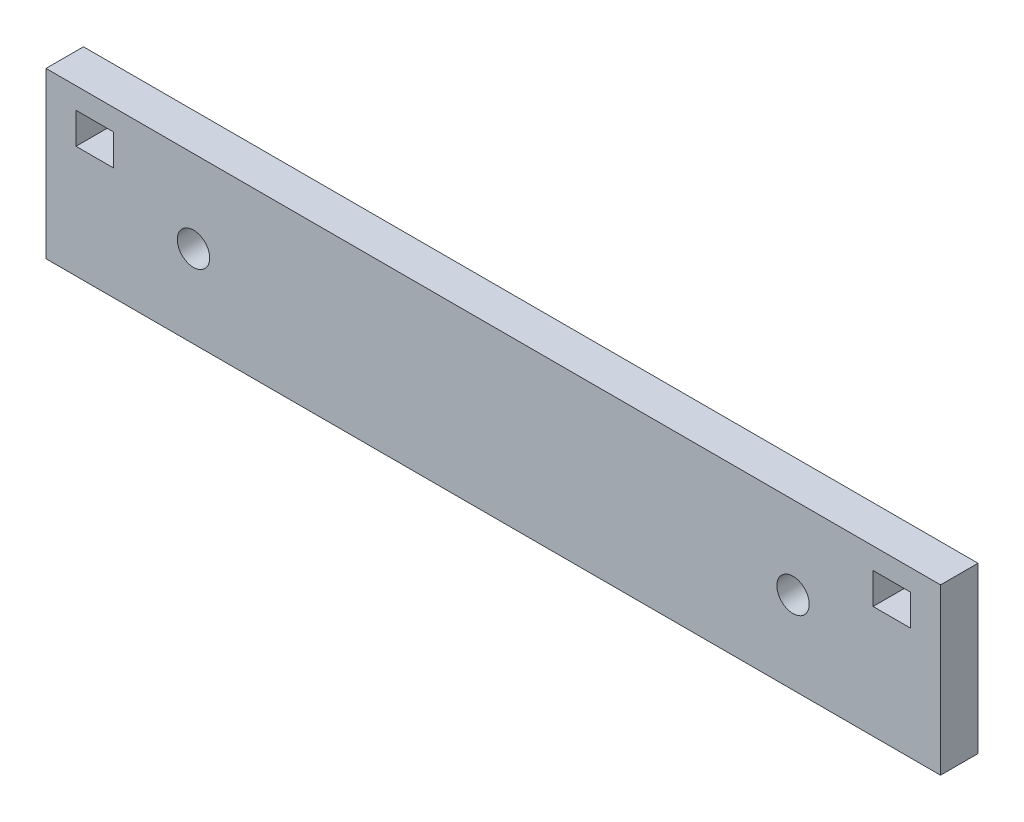
ISO-10303-21;
HEADER;
FILE_DESCRIPTION(('STEP AP214'),'2;1');
FILE_NAME('part.step','',(''),(''),'','','');
FILE_SCHEMA(('AUTOMOTIVE_DESIGN { 1 0 10303 214 1 1 1 1 }'));
ENDSEC;
DATA;
#1=APPLICATION_CONTEXT('core data for automotive mechanical design processes');
#2=APPLICATION_PROTOCOL_DEFINITION('international standard','automotive_design',2000,#1);
#3=PRODUCT_CONTEXT('',#1,'mechanical');
#4=PRODUCT('Part','Part','',(#3));
#5=PRODUCT_RELATED_PRODUCT_CATEGORY('part','',(#4));
#6=PRODUCT_DEFINITION_FORMATION('','',#4);
#7=PRODUCT_DEFINITION_CONTEXT('part definition',#1,'design');
#8=PRODUCT_DEFINITION('design','',#6,#7);
#9=PRODUCT_DEFINITION_SHAPE('','',#8);
#10=(LENGTH_UNIT() NAMED_UNIT(*) SI_UNIT(.MILLI.,.METRE.));
#11=(NAMED_UNIT(*) PLANE_ANGLE_UNIT() SI_UNIT($,.RADIAN.));
#12=(NAMED_UNIT(*) SI_UNIT($,.STERADIAN.) SOLID_ANGLE_UNIT());
#13=UNCERTAINTY_MEASURE_WITH_UNIT(LENGTH_MEASURE(1.E-05),#10,'distance_accuracy_value','');
#14=(GEOMETRIC_REPRESENTATION_CONTEXT(3) GLOBAL_UNCERTAINTY_ASSIGNED_CONTEXT((#13)) GLOBAL_UNIT_ASSIGNED_CONTEXT((#10,
#11,#12)) REPRESENTATION_CONTEXT('',''));
#15=CARTESIAN_POINT('',(0.,0.,0.));
#16=DIRECTION('',(0.,0.,1.));
#17=DIRECTION('',(1.,0.,0.));
#18=AXIS2_PLACEMENT_3D('',#15,#16,#17);
#19=CARTESIAN_POINT('',(-18.9484,3.4925,1.5875));
#20=DIRECTION('',(0.,0.,1.));
#21=DIRECTION('',(1.,0.,0.));
#22=AXIS2_PLACEMENT_3D('',#19,#20,#21);
#23=PLANE('',#22);
#24=CARTESIAN_POINT('',(-12.7,0.,1.5875));
#25=DIRECTION('',(0.,0.,1.));
#26=DIRECTION('',(1.,0.,0.));
#27=AXIS2_PLACEMENT_3D('',#24,#25,#26);
#28=CIRCLE('',#27,0.685800000000001);
#29=CARTESIAN_POINT('',(-12.0142,0.,1.5875));
#30=VERTEX_POINT('',#29);
#31=EDGE_CURVE('E151',#30,#30,#28,.T.);
#32=ORIENTED_EDGE('',*,*,#31,.F.);
#33=EDGE_LOOP('',(#32));
#34=FACE_BOUND('',#33,.T.);
#35=DIRECTION('',(0.,-1.,0.));
#36=VECTOR('',#35,1.);
#37=CARTESIAN_POINT('',(-17.6784,2.5908,1.5875));
#38=LINE('',#37,#36);
#39=CARTESIAN_POINT('',(-17.6784,2.5908,1.5875));
#40=VERTEX_POINT('',#39);
#41=CARTESIAN_POINT('',(-17.6784,1.27,1.5875));
#42=VERTEX_POINT('',#41);
#43=EDGE_CURVE('E163',#40,#42,#38,.T.);
#44=ORIENTED_EDGE('',*,*,#43,.F.);
#45=DIRECTION('',(-1.,0.,0.));
#46=VECTOR('',#45,1.);
#47=CARTESIAN_POINT('',(-16.0909,2.5908,1.5875));
#48=LINE('',#47,#46);
#49=CARTESIAN_POINT('',(-16.0909,2.5908,1.5875));
#50=VERTEX_POINT('',#49);
#51=EDGE_CURVE('E161',#50,#40,#48,.T.);
#52=ORIENTED_EDGE('',*,*,#51,.F.);
#53=DIRECTION('',(0.,1.,0.));
#54=VECTOR('',#53,1.);
#55=CARTESIAN_POINT('',(-16.0909,1.27,1.5875));
#56=LINE('',#55,#54);
#57=CARTESIAN_POINT('',(-16.0909,1.27,1.5875));
#58=VERTEX_POINT('',#57);
#59=EDGE_CURVE('E169',#58,#50,#56,.T.);
#60=ORIENTED_EDGE('',*,*,#59,.F.);
#61=DIRECTION('',(1.,0.,0.));
#62=VECTOR('',#61,1.);
#63=CARTESIAN_POINT('',(-17.6784,1.27,1.5875));
#64=LINE('',#63,#62);
#65=EDGE_CURVE('E166',#42,#58,#64,.T.);
#66=ORIENTED_EDGE('',*,*,#65,.F.);
#67=EDGE_LOOP('',(#44,#52,#60,#66));
#68=FACE_BOUND('',#67,.T.);
#69=DIRECTION('',(0.,-1.,0.));
#70=VECTOR('',#69,1.);
#71=CARTESIAN_POINT('',(-18.9484,-3.4925,1.5875));
#72=LINE('',#71,#70);
#73=CARTESIAN_POINT('',(-18.9484,3.4925,1.5875));
#74=VERTEX_POINT('',#73);
#75=CARTESIAN_POINT('',(-18.9484,-3.4925,1.5875));
#76=VERTEX_POINT('',#75);
#77=EDGE_CURVE('E192',#74,#76,#72,.T.);
#78=ORIENTED_EDGE('',*,*,#77,.T.);
#79=DIRECTION('',(1.,0.,0.));
#80=VECTOR('',#79,1.);
#81=CARTESIAN_POINT('',(18.9484,-3.4925,1.5875));
#82=LINE('',#81,#80);
#83=CARTESIAN_POINT('',(18.9484,-3.4925,1.5875));
#84=VERTEX_POINT('',#83);
#85=EDGE_CURVE('E195',#76,#84,#82,.T.);
#86=ORIENTED_EDGE('',*,*,#85,.T.);
#87=DIRECTION('',(0.,1.,0.));
#88=VECTOR('',#87,1.);
#89=CARTESIAN_POINT('',(18.9484,-3.4925,1.5875));
#90=LINE('',#89,#88);
#91=CARTESIAN_POINT('',(18.9484,3.4925,1.5875));
#92=VERTEX_POINT('',#91);
#93=EDGE_CURVE('E198',#84,#92,#90,.T.);
#94=ORIENTED_EDGE('',*,*,#93,.T.);
#95=DIRECTION('',(-1.,0.,0.));
#96=VECTOR('',#95,1.);
#97=CARTESIAN_POINT('',(18.9484,3.4925,1.5875));
#98=LINE('',#97,#96);
#99=EDGE_CURVE('E200',#92,#74,#98,.T.);
#100=ORIENTED_EDGE('',*,*,#99,.T.);
#101=EDGE_LOOP('',(#78,#86,#94,#100));
#102=FACE_BOUND('',#101,.T.);
#103=DIRECTION('',(0.,-1.,0.));
#104=VECTOR('',#103,1.);
#105=CARTESIAN_POINT('',(16.0909,2.59080000000001,1.5875));
#106=LINE('',#105,#104);
#107=CARTESIAN_POINT('',(16.0909,2.59080000000001,1.5875));
#108=VERTEX_POINT('',#107);
#109=CARTESIAN_POINT('',(16.0909,1.27000000000001,1.5875));
#110=VERTEX_POINT('',#109);
#111=EDGE_CURVE('E130',#108,#110,#106,.T.);
#112=ORIENTED_EDGE('',*,*,#111,.F.);
#113=DIRECTION('',(-1.,0.,0.));
#114=VECTOR('',#113,1.);
#115=CARTESIAN_POINT('',(17.6784,2.59080000000001,1.5875));
#116=LINE('',#115,#114);
#117=CARTESIAN_POINT('',(17.6784,2.59080000000001,1.5875));
#118=VERTEX_POINT('',#117);
#119=EDGE_CURVE('E122',#118,#108,#116,.T.);
#120=ORIENTED_EDGE('',*,*,#119,.F.);
#121=DIRECTION('',(0.,1.,0.));
#122=VECTOR('',#121,1.);
#123=CARTESIAN_POINT('',(17.6784,1.27,1.5875));
#124=LINE('',#123,#122);
#125=CARTESIAN_POINT('',(17.6784,1.27000000000001,1.5875));
#126=VERTEX_POINT('',#125);
#127=EDGE_CURVE('E145',#126,#118,#124,.T.);
#128=ORIENTED_EDGE('',*,*,#127,.F.);
#129=DIRECTION('',(1.,0.,0.));
#130=VECTOR('',#129,1.);
#131=CARTESIAN_POINT('',(16.0909,1.27000000000001,1.5875));
#132=LINE('',#131,#130);
#133=EDGE_CURVE('E143',#110,#126,#132,.T.);
#134=ORIENTED_EDGE('',*,*,#133,.F.);
#135=EDGE_LOOP('',(#112,#120,#128,#134));
#136=FACE_BOUND('',#135,.T.);
#137=CARTESIAN_POINT('',(12.7,0.,1.5875));
#138=DIRECTION('',(0.,0.,1.));
#139=DIRECTION('',(-1.,0.,0.));
#140=AXIS2_PLACEMENT_3D('',#137,#138,#139);
#141=CIRCLE('',#140,0.685800000000001);
#142=CARTESIAN_POINT('',(12.0142,0.,1.5875));
#143=VERTEX_POINT('',#142);
#144=EDGE_CURVE('E310',#143,#143,#141,.T.);
#145=ORIENTED_EDGE('',*,*,#144,.F.);
#146=EDGE_LOOP('',(#145));
#147=FACE_BOUND('',#146,.T.);
#148=ADVANCED_FACE('F33',(#34,#68,#102,#136,#147),#23,.T.);
#149=CARTESIAN_POINT('',(-18.9484,3.4925,0.));
#150=DIRECTION('',(0.,0.,1.));
#151=DIRECTION('',(1.,0.,0.));
#152=AXIS2_PLACEMENT_3D('',#149,#150,#151);
#153=PLANE('',#152);
#154=CARTESIAN_POINT('',(-12.7,0.,0.));
#155=DIRECTION('',(0.,0.,1.));
#156=DIRECTION('',(1.,0.,0.));
#157=AXIS2_PLACEMENT_3D('',#154,#155,#156);
#158=CIRCLE('',#157,0.685800000000001);
#159=CARTESIAN_POINT('',(-12.0142,0.,0.));
#160=VERTEX_POINT('',#159);
#161=EDGE_CURVE('E316',#160,#160,#158,.T.);
#162=ORIENTED_EDGE('',*,*,#161,.T.);
#163=EDGE_LOOP('',(#162));
#164=FACE_BOUND('',#163,.T.);
#165=DIRECTION('',(-1.,0.,0.));
#166=VECTOR('',#165,1.);
#167=CARTESIAN_POINT('',(-16.0909,2.5908,0.));
#168=LINE('',#167,#166);
#169=CARTESIAN_POINT('',(-16.0909,2.5908,0.));
#170=VERTEX_POINT('',#169);
#171=CARTESIAN_POINT('',(-17.6784,2.5908,0.));
#172=VERTEX_POINT('',#171);
#173=EDGE_CURVE('E138',#170,#172,#168,.T.);
#174=ORIENTED_EDGE('',*,*,#173,.T.);
#175=DIRECTION('',(0.,-1.,0.));
#176=VECTOR('',#175,1.);
#177=CARTESIAN_POINT('',(-17.6784,2.5908,0.));
#178=LINE('',#177,#176);
#179=CARTESIAN_POINT('',(-17.6784,1.27,0.));
#180=VERTEX_POINT('',#179);
#181=EDGE_CURVE('E174',#172,#180,#178,.T.);
#182=ORIENTED_EDGE('',*,*,#181,.T.);
#183=DIRECTION('',(1.,0.,0.));
#184=VECTOR('',#183,1.);
#185=CARTESIAN_POINT('',(-17.6784,1.27,0.));
#186=LINE('',#185,#184);
#187=CARTESIAN_POINT('',(-16.0909,1.27,0.));
#188=VERTEX_POINT('',#187);
#189=EDGE_CURVE('E177',#180,#188,#186,.T.);
#190=ORIENTED_EDGE('',*,*,#189,.T.);
#191=DIRECTION('',(0.,1.,0.));
#192=VECTOR('',#191,1.);
#193=CARTESIAN_POINT('',(-16.0909,1.27,0.));
#194=LINE('',#193,#192);
#195=EDGE_CURVE('E164',#188,#170,#194,.T.);
#196=ORIENTED_EDGE('',*,*,#195,.T.);
#197=EDGE_LOOP('',(#174,#182,#190,#196));
#198=FACE_BOUND('',#197,.T.);
#199=DIRECTION('',(0.,-1.,0.));
#200=VECTOR('',#199,1.);
#201=CARTESIAN_POINT('',(-18.9484,-3.4925,0.));
#202=LINE('',#201,#200);
#203=CARTESIAN_POINT('',(-18.9484,3.4925,0.));
#204=VERTEX_POINT('',#203);
#205=CARTESIAN_POINT('',(-18.9484,-3.4925,0.));
#206=VERTEX_POINT('',#205);
#207=EDGE_CURVE('E191',#204,#206,#202,.T.);
#208=ORIENTED_EDGE('',*,*,#207,.F.);
#209=DIRECTION('',(-1.,0.,0.));
#210=VECTOR('',#209,1.);
#211=CARTESIAN_POINT('',(18.9484,3.4925,0.));
#212=LINE('',#211,#210);
#213=CARTESIAN_POINT('',(18.9484,3.4925,0.));
#214=VERTEX_POINT('',#213);
#215=EDGE_CURVE('E196',#214,#204,#212,.T.);
#216=ORIENTED_EDGE('',*,*,#215,.F.);
#217=DIRECTION('',(0.,1.,0.));
#218=VECTOR('',#217,1.);
#219=CARTESIAN_POINT('',(18.9484,-3.4925,0.));
#220=LINE('',#219,#218);
#221=CARTESIAN_POINT('',(18.9484,-3.4925,0.));
#222=VERTEX_POINT('',#221);
#223=EDGE_CURVE('E207',#222,#214,#220,.T.);
#224=ORIENTED_EDGE('',*,*,#223,.F.);
#225=DIRECTION('',(1.,0.,0.));
#226=VECTOR('',#225,1.);
#227=CARTESIAN_POINT('',(18.9484,-3.4925,0.));
#228=LINE('',#227,#226);
#229=EDGE_CURVE('E205',#206,#222,#228,.T.);
#230=ORIENTED_EDGE('',*,*,#229,.F.);
#231=EDGE_LOOP('',(#208,#216,#224,#230));
#232=FACE_BOUND('',#231,.T.);
#233=DIRECTION('',(-1.,0.,0.));
#234=VECTOR('',#233,1.);
#235=CARTESIAN_POINT('',(17.6784,2.59080000000001,0.));
#236=LINE('',#235,#234);
#237=CARTESIAN_POINT('',(17.6784,2.59080000000001,0.));
#238=VERTEX_POINT('',#237);
#239=CARTESIAN_POINT('',(16.0909,2.59080000000001,0.));
#240=VERTEX_POINT('',#239);
#241=EDGE_CURVE('E56',#238,#240,#236,.T.);
#242=ORIENTED_EDGE('',*,*,#241,.T.);
#243=DIRECTION('',(0.,-1.,0.));
#244=VECTOR('',#243,1.);
#245=CARTESIAN_POINT('',(16.0909,2.59080000000001,0.));
#246=LINE('',#245,#244);
#247=CARTESIAN_POINT('',(16.0909,1.27000000000001,0.));
#248=VERTEX_POINT('',#247);
#249=EDGE_CURVE('E137',#240,#248,#246,.T.);
#250=ORIENTED_EDGE('',*,*,#249,.T.);
#251=DIRECTION('',(1.,0.,0.));
#252=VECTOR('',#251,1.);
#253=CARTESIAN_POINT('',(16.0909,1.27000000000001,0.));
#254=LINE('',#253,#252);
#255=CARTESIAN_POINT('',(17.6784,1.27,0.));
#256=VERTEX_POINT('',#255);
#257=EDGE_CURVE('E153',#248,#256,#254,.T.);
#258=ORIENTED_EDGE('',*,*,#257,.T.);
#259=DIRECTION('',(0.,1.,0.));
#260=VECTOR('',#259,1.);
#261=CARTESIAN_POINT('',(17.6784,1.27,0.));
#262=LINE('',#261,#260);
#263=EDGE_CURVE('E131',#256,#238,#262,.T.);
#264=ORIENTED_EDGE('',*,*,#263,.T.);
#265=EDGE_LOOP('',(#242,#250,#258,#264));
#266=FACE_BOUND('',#265,.T.);
#267=CARTESIAN_POINT('',(12.7,0.,0.));
#268=DIRECTION('',(0.,0.,1.));
#269=DIRECTION('',(-1.,0.,0.));
#270=AXIS2_PLACEMENT_3D('',#267,#268,#269);
#271=CIRCLE('',#270,0.685800000000001);
#272=CARTESIAN_POINT('',(12.0142,0.,0.));
#273=VERTEX_POINT('',#272);
#274=EDGE_CURVE('E313',#273,#273,#271,.T.);
#275=ORIENTED_EDGE('',*,*,#274,.T.);
#276=EDGE_LOOP('',(#275));
#277=FACE_BOUND('',#276,.T.);
#278=ADVANCED_FACE('F225',(#164,#198,#232,#266,#277),#153,.F.);
#279=CARTESIAN_POINT('',(-18.9484,-3.4925,1.5875));
#280=DIRECTION('',(1.,0.,0.));
#281=DIRECTION('',(0.,0.,-1.));
#282=AXIS2_PLACEMENT_3D('',#279,#280,#281);
#283=PLANE('',#282);
#284=ORIENTED_EDGE('',*,*,#207,.T.);
#285=DIRECTION('',(0.,0.,-1.));
#286=VECTOR('',#285,1.);
#287=CARTESIAN_POINT('',(-18.9484,-3.4925,1.5875));
#288=LINE('',#287,#286);
#289=EDGE_CURVE('E11',#76,#206,#288,.T.);
#290=ORIENTED_EDGE('',*,*,#289,.F.);
#291=ORIENTED_EDGE('',*,*,#77,.F.);
#292=DIRECTION('',(0.,0.,-1.));
#293=VECTOR('',#292,1.);
#294=CARTESIAN_POINT('',(-18.9484,3.4925,1.5875));
#295=LINE('',#294,#293);
#296=EDGE_CURVE('E202',#74,#204,#295,.T.);
#297=ORIENTED_EDGE('',*,*,#296,.T.);
#298=EDGE_LOOP('',(#284,#290,#291,#297));
#299=FACE_BOUND('',#298,.T.);
#300=ADVANCED_FACE('F35',(#299),#283,.F.);
#301=CARTESIAN_POINT('',(18.9484,-3.4925,1.5875));
#302=DIRECTION('',(0.,1.,0.));
#303=DIRECTION('',(0.,0.,1.));
#304=AXIS2_PLACEMENT_3D('',#301,#302,#303);
#305=PLANE('',#304);
#306=ORIENTED_EDGE('',*,*,#229,.T.);
#307=DIRECTION('',(0.,0.,-1.));
#308=VECTOR('',#307,1.);
#309=CARTESIAN_POINT('',(18.9484,-3.4925,1.5875));
#310=LINE('',#309,#308);
#311=EDGE_CURVE('E41',#84,#222,#310,.T.);
#312=ORIENTED_EDGE('',*,*,#311,.F.);
#313=ORIENTED_EDGE('',*,*,#85,.F.);
#314=ORIENTED_EDGE('',*,*,#289,.T.);
#315=EDGE_LOOP('',(#306,#312,#313,#314));
#316=FACE_BOUND('',#315,.T.);
#317=ADVANCED_FACE('F235',(#316),#305,.F.);
#318=CARTESIAN_POINT('',(18.9484,-3.4925,1.5875));
#319=DIRECTION('',(-1.,0.,0.));
#320=DIRECTION('',(0.,0.,1.));
#321=AXIS2_PLACEMENT_3D('',#318,#319,#320);
#322=PLANE('',#321);
#323=ORIENTED_EDGE('',*,*,#223,.T.);
#324=DIRECTION('',(0.,0.,-1.));
#325=VECTOR('',#324,1.);
#326=CARTESIAN_POINT('',(18.9484,3.4925,1.5875));
#327=LINE('',#326,#325);
#328=EDGE_CURVE('E212',#92,#214,#327,.T.);
#329=ORIENTED_EDGE('',*,*,#328,.F.);
#330=ORIENTED_EDGE('',*,*,#93,.F.);
#331=ORIENTED_EDGE('',*,*,#311,.T.);
#332=EDGE_LOOP('',(#323,#329,#330,#331));
#333=FACE_BOUND('',#332,.T.);
#334=ADVANCED_FACE('F219',(#333),#322,.F.);
#335=CARTESIAN_POINT('',(18.9484,3.4925,1.5875));
#336=DIRECTION('',(0.,-1.,0.));
#337=DIRECTION('',(0.,0.,-1.));
#338=AXIS2_PLACEMENT_3D('',#335,#336,#337);
#339=PLANE('',#338);
#340=ORIENTED_EDGE('',*,*,#215,.T.);
#341=ORIENTED_EDGE('',*,*,#296,.F.);
#342=ORIENTED_EDGE('',*,*,#99,.F.);
#343=ORIENTED_EDGE('',*,*,#328,.T.);
#344=EDGE_LOOP('',(#340,#341,#342,#343));
#345=FACE_BOUND('',#344,.T.);
#346=ADVANCED_FACE('F229',(#345),#339,.F.);
#347=CARTESIAN_POINT('',(-16.0909,2.5908,1.5875));
#348=DIRECTION('',(0.,-1.,0.));
#349=DIRECTION('',(0.,0.,-1.));
#350=AXIS2_PLACEMENT_3D('',#347,#348,#349);
#351=PLANE('',#350);
#352=ORIENTED_EDGE('',*,*,#173,.F.);
#353=DIRECTION('',(0.,0.,-1.));
#354=VECTOR('',#353,1.);
#355=CARTESIAN_POINT('',(-16.0909,2.5908,1.5875));
#356=LINE('',#355,#354);
#357=EDGE_CURVE('E171',#50,#170,#356,.T.);
#358=ORIENTED_EDGE('',*,*,#357,.F.);
#359=ORIENTED_EDGE('',*,*,#51,.T.);
#360=DIRECTION('',(0.,0.,-1.));
#361=VECTOR('',#360,1.);
#362=CARTESIAN_POINT('',(-17.6784,2.5908,1.5875));
#363=LINE('',#362,#361);
#364=EDGE_CURVE('E188',#40,#172,#363,.T.);
#365=ORIENTED_EDGE('',*,*,#364,.T.);
#366=EDGE_LOOP('',(#352,#358,#359,#365));
#367=FACE_BOUND('',#366,.T.);
#368=ADVANCED_FACE('F253',(#367),#351,.T.);
#369=CARTESIAN_POINT('',(-17.6784,2.5908,1.5875));
#370=DIRECTION('',(1.,0.,0.));
#371=DIRECTION('',(0.,0.,-1.));
#372=AXIS2_PLACEMENT_3D('',#369,#370,#371);
#373=PLANE('',#372);
#374=ORIENTED_EDGE('',*,*,#181,.F.);
#375=ORIENTED_EDGE('',*,*,#364,.F.);
#376=ORIENTED_EDGE('',*,*,#43,.T.);
#377=DIRECTION('',(0.,0.,-1.));
#378=VECTOR('',#377,1.);
#379=CARTESIAN_POINT('',(-17.6784,1.27,1.5875));
#380=LINE('',#379,#378);
#381=EDGE_CURVE('E186',#42,#180,#380,.T.);
#382=ORIENTED_EDGE('',*,*,#381,.T.);
#383=EDGE_LOOP('',(#374,#375,#376,#382));
#384=FACE_BOUND('',#383,.T.);
#385=ADVANCED_FACE('F260',(#384),#373,.T.);
#386=CARTESIAN_POINT('',(-17.6784,1.27,1.5875));
#387=DIRECTION('',(0.,1.,0.));
#388=DIRECTION('',(-1.,0.,0.));
#389=AXIS2_PLACEMENT_3D('',#386,#387,#388);
#390=PLANE('',#389);
#391=ORIENTED_EDGE('',*,*,#189,.F.);
#392=ORIENTED_EDGE('',*,*,#381,.F.);
#393=ORIENTED_EDGE('',*,*,#65,.T.);
#394=DIRECTION('',(0.,0.,-1.));
#395=VECTOR('',#394,1.);
#396=CARTESIAN_POINT('',(-16.0909,1.27,1.5875));
#397=LINE('',#396,#395);
#398=EDGE_CURVE('E184',#58,#188,#397,.T.);
#399=ORIENTED_EDGE('',*,*,#398,.T.);
#400=EDGE_LOOP('',(#391,#392,#393,#399));
#401=FACE_BOUND('',#400,.T.);
#402=ADVANCED_FACE('F265',(#401),#390,.T.);
#403=CARTESIAN_POINT('',(-16.0909,1.27,1.5875));
#404=DIRECTION('',(-1.,0.,0.));
#405=DIRECTION('',(0.,0.,1.));
#406=AXIS2_PLACEMENT_3D('',#403,#404,#405);
#407=PLANE('',#406);
#408=ORIENTED_EDGE('',*,*,#195,.F.);
#409=ORIENTED_EDGE('',*,*,#398,.F.);
#410=ORIENTED_EDGE('',*,*,#59,.T.);
#411=ORIENTED_EDGE('',*,*,#357,.T.);
#412=EDGE_LOOP('',(#408,#409,#410,#411));
#413=FACE_BOUND('',#412,.T.);
#414=ADVANCED_FACE('F273',(#413),#407,.T.);
#415=CARTESIAN_POINT('',(17.6784,2.59080000000001,1.5875));
#416=DIRECTION('',(0.,-1.,0.));
#417=DIRECTION('',(0.,0.,-1.));
#418=AXIS2_PLACEMENT_3D('',#415,#416,#417);
#419=PLANE('',#418);
#420=ORIENTED_EDGE('',*,*,#241,.F.);
#421=DIRECTION('',(0.,0.,-1.));
#422=VECTOR('',#421,1.);
#423=CARTESIAN_POINT('',(17.6784,2.59080000000001,1.5875));
#424=LINE('',#423,#422);
#425=EDGE_CURVE('E126',#118,#238,#424,.T.);
#426=ORIENTED_EDGE('',*,*,#425,.F.);
#427=ORIENTED_EDGE('',*,*,#119,.T.);
#428=DIRECTION('',(0.,0.,-1.));
#429=VECTOR('',#428,1.);
#430=CARTESIAN_POINT('',(16.0909,2.59080000000001,1.5875));
#431=LINE('',#430,#429);
#432=EDGE_CURVE('E125',#108,#240,#431,.T.);
#433=ORIENTED_EDGE('',*,*,#432,.T.);
#434=EDGE_LOOP('',(#420,#426,#427,#433));
#435=FACE_BOUND('',#434,.T.);
#436=ADVANCED_FACE('F124',(#435),#419,.T.);
#437=CARTESIAN_POINT('',(16.0909,2.59080000000001,1.5875));
#438=DIRECTION('',(1.,0.,0.));
#439=DIRECTION('',(0.,0.,-1.));
#440=AXIS2_PLACEMENT_3D('',#437,#438,#439);
#441=PLANE('',#440);
#442=ORIENTED_EDGE('',*,*,#249,.F.);
#443=ORIENTED_EDGE('',*,*,#432,.F.);
#444=ORIENTED_EDGE('',*,*,#111,.T.);
#445=DIRECTION('',(0.,0.,-1.));
#446=VECTOR('',#445,1.);
#447=CARTESIAN_POINT('',(16.0909,1.27000000000001,1.5875));
#448=LINE('',#447,#446);
#449=EDGE_CURVE('E139',#110,#248,#448,.T.);
#450=ORIENTED_EDGE('',*,*,#449,.T.);
#451=EDGE_LOOP('',(#442,#443,#444,#450));
#452=FACE_BOUND('',#451,.T.);
#453=ADVANCED_FACE('F134',(#452),#441,.T.);
#454=CARTESIAN_POINT('',(16.0909,1.27000000000001,1.5875));
#455=DIRECTION('',(0.,1.,0.));
#456=DIRECTION('',(-1.,0.,0.));
#457=AXIS2_PLACEMENT_3D('',#454,#455,#456);
#458=PLANE('',#457);
#459=ORIENTED_EDGE('',*,*,#257,.F.);
#460=ORIENTED_EDGE('',*,*,#449,.F.);
#461=ORIENTED_EDGE('',*,*,#133,.T.);
#462=DIRECTION('',(0.,0.,-1.));
#463=VECTOR('',#462,1.);
#464=CARTESIAN_POINT('',(17.6784,1.27,1.5875));
#465=LINE('',#464,#463);
#466=EDGE_CURVE('E48',#126,#256,#465,.T.);
#467=ORIENTED_EDGE('',*,*,#466,.T.);
#468=EDGE_LOOP('',(#459,#460,#461,#467));
#469=FACE_BOUND('',#468,.T.);
#470=ADVANCED_FACE('F291',(#469),#458,.T.);
#471=CARTESIAN_POINT('',(17.6784,1.27,1.5875));
#472=DIRECTION('',(-1.,0.,0.));
#473=DIRECTION('',(0.,0.,1.));
#474=AXIS2_PLACEMENT_3D('',#471,#472,#473);
#475=PLANE('',#474);
#476=ORIENTED_EDGE('',*,*,#263,.F.);
#477=ORIENTED_EDGE('',*,*,#466,.F.);
#478=ORIENTED_EDGE('',*,*,#127,.T.);
#479=ORIENTED_EDGE('',*,*,#425,.T.);
#480=EDGE_LOOP('',(#476,#477,#478,#479));
#481=FACE_BOUND('',#480,.T.);
#482=ADVANCED_FACE('F294',(#481),#475,.T.);
#483=CARTESIAN_POINT('',(-12.7,0.,1.5875));
#484=DIRECTION('',(0.,0.,-1.));
#485=DIRECTION('',(-1.,0.,0.));
#486=AXIS2_PLACEMENT_3D('',#483,#484,#485);
#487=CYLINDRICAL_SURFACE('',#486,0.685800000000001);
#488=ORIENTED_EDGE('',*,*,#31,.T.);
#489=EDGE_LOOP('',(#488));
#490=FACE_BOUND('',#489,.T.);
#491=ORIENTED_EDGE('',*,*,#161,.F.);
#492=EDGE_LOOP('',(#491));
#493=FACE_BOUND('',#492,.T.);
#494=ADVANCED_FACE('F298',(#490,#493),#487,.F.);
#495=CARTESIAN_POINT('',(12.7,0.,1.5875));
#496=DIRECTION('',(0.,0.,-1.));
#497=DIRECTION('',(-1.,0.,0.));
#498=AXIS2_PLACEMENT_3D('',#495,#496,#497);
#499=CYLINDRICAL_SURFACE('',#498,0.685800000000001);
#500=ORIENTED_EDGE('',*,*,#144,.T.);
#501=EDGE_LOOP('',(#500));
#502=FACE_BOUND('',#501,.T.);
#503=ORIENTED_EDGE('',*,*,#274,.F.);
#504=EDGE_LOOP('',(#503));
#505=FACE_BOUND('',#504,.T.);
#506=ADVANCED_FACE('F301',(#502,#505),#499,.F.);
#507=CLOSED_SHELL('',(#148,#278,#300,#317,#334,#346,#368,#385,#402,#414,#436,#453,#470,#482,
#494,#506));
#508=MANIFOLD_SOLID_BREP('B2',#507);
#509=ADVANCED_BREP_SHAPE_REPRESENTATION('',(#18,#508),#14);
#510=SHAPE_DEFINITION_REPRESENTATION(#9,#509);
ENDSEC;
END-ISO-10303-21;
